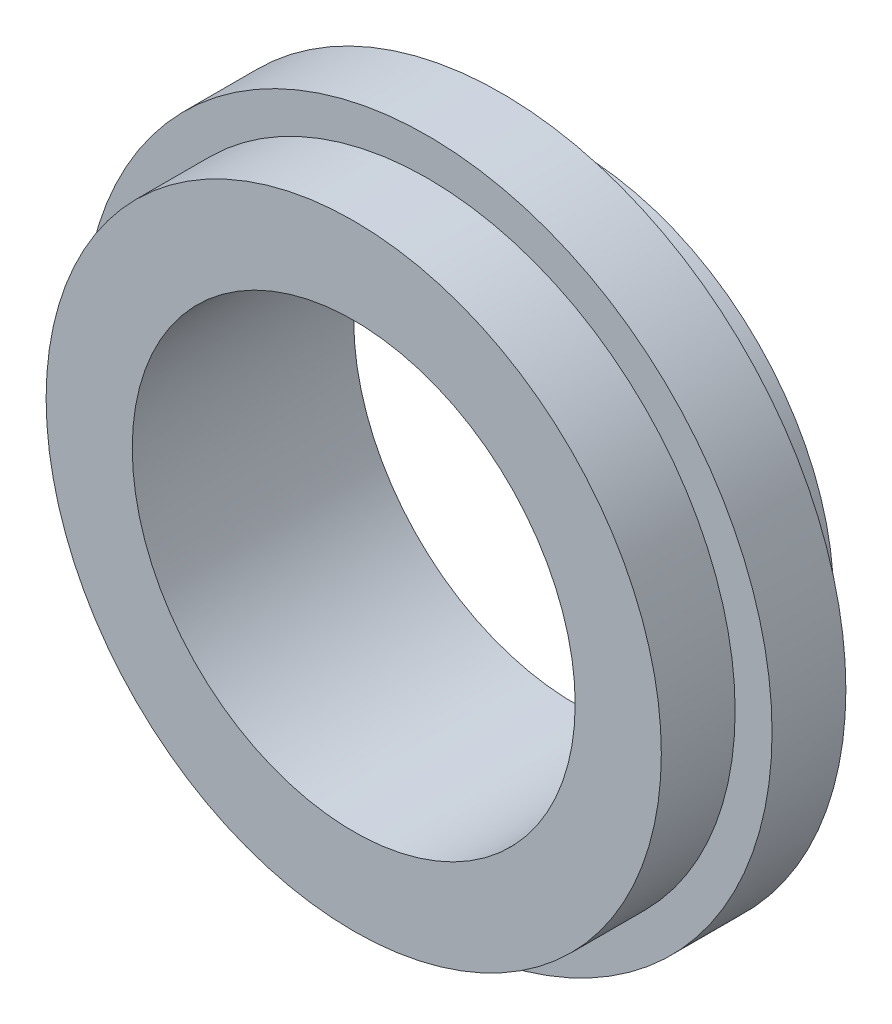
ISO-10303-21;
HEADER;
FILE_DESCRIPTION(('STEP AP214'),'2;1');
FILE_NAME('part.step','',(''),(''),'','','');
FILE_SCHEMA(('AUTOMOTIVE_DESIGN { 1 0 10303 214 1 1 1 1 }'));
ENDSEC;
DATA;
#1=APPLICATION_CONTEXT('core data for automotive mechanical design processes');
#2=APPLICATION_PROTOCOL_DEFINITION('international standard','automotive_design',2000,#1);
#3=PRODUCT_CONTEXT('',#1,'mechanical');
#4=PRODUCT('Part','Part','',(#3));
#5=PRODUCT_RELATED_PRODUCT_CATEGORY('part','',(#4));
#6=PRODUCT_DEFINITION_FORMATION('','',#4);
#7=PRODUCT_DEFINITION_CONTEXT('part definition',#1,'design');
#8=PRODUCT_DEFINITION('design','',#6,#7);
#9=PRODUCT_DEFINITION_SHAPE('','',#8);
#10=(LENGTH_UNIT() NAMED_UNIT(*) SI_UNIT(.MILLI.,.METRE.));
#11=(NAMED_UNIT(*) PLANE_ANGLE_UNIT() SI_UNIT($,.RADIAN.));
#12=(NAMED_UNIT(*) SI_UNIT($,.STERADIAN.) SOLID_ANGLE_UNIT());
#13=UNCERTAINTY_MEASURE_WITH_UNIT(LENGTH_MEASURE(1.E-05),#10,'distance_accuracy_value','');
#14=(GEOMETRIC_REPRESENTATION_CONTEXT(3) GLOBAL_UNCERTAINTY_ASSIGNED_CONTEXT((#13)) GLOBAL_UNIT_ASSIGNED_CONTEXT((#10,
#11,#12)) REPRESENTATION_CONTEXT('',''));
#15=CARTESIAN_POINT('',(0.,0.,0.));
#16=DIRECTION('',(0.,0.,1.));
#17=DIRECTION('',(1.,0.,0.));
#18=AXIS2_PLACEMENT_3D('',#15,#16,#17);
#19=CARTESIAN_POINT('',(0.,0.,0.));
#20=DIRECTION('',(0.,0.,1.));
#21=DIRECTION('',(1.,0.,0.));
#22=AXIS2_PLACEMENT_3D('',#19,#20,#21);
#23=PLANE('',#22);
#24=CARTESIAN_POINT('',(0.,0.,0.));
#25=DIRECTION('',(0.,0.,1.));
#26=DIRECTION('',(1.,0.,0.));
#27=AXIS2_PLACEMENT_3D('',#24,#25,#26);
#28=CIRCLE('',#27,10.5);
#29=CARTESIAN_POINT('',(10.5,0.,0.));
#30=VERTEX_POINT('',#29);
#31=EDGE_CURVE('E39',#30,#30,#28,.T.);
#32=ORIENTED_EDGE('',*,*,#31,.F.);
#33=EDGE_LOOP('',(#32));
#34=FACE_BOUND('',#33,.T.);
#35=CARTESIAN_POINT('',(0.,0.,0.));
#36=DIRECTION('',(0.,0.,1.));
#37=DIRECTION('',(1.,0.,0.));
#38=AXIS2_PLACEMENT_3D('',#35,#36,#37);
#39=CIRCLE('',#38,9.);
#40=CARTESIAN_POINT('',(9.,0.,0.));
#41=VERTEX_POINT('',#40);
#42=EDGE_CURVE('E55',#41,#41,#39,.T.);
#43=ORIENTED_EDGE('',*,*,#42,.T.);
#44=EDGE_LOOP('',(#43));
#45=FACE_BOUND('',#44,.T.);
#46=ADVANCED_FACE('F35',(#34,#45),#23,.F.);
#47=CARTESIAN_POINT('',(0.,0.,3.));
#48=DIRECTION('',(0.,0.,-1.));
#49=DIRECTION('',(-1.,0.,0.));
#50=AXIS2_PLACEMENT_3D('',#47,#48,#49);
#51=CYLINDRICAL_SURFACE('',#50,10.5);
#52=CARTESIAN_POINT('',(0.,0.,3.));
#53=DIRECTION('',(0.,0.,1.));
#54=DIRECTION('',(1.,0.,0.));
#55=AXIS2_PLACEMENT_3D('',#52,#53,#54);
#56=CIRCLE('',#55,10.5);
#57=CARTESIAN_POINT('',(10.5,0.,3.));
#58=VERTEX_POINT('',#57);
#59=EDGE_CURVE('E43',#58,#58,#56,.T.);
#60=ORIENTED_EDGE('',*,*,#59,.F.);
#61=EDGE_LOOP('',(#60));
#62=FACE_BOUND('',#61,.T.);
#63=ORIENTED_EDGE('',*,*,#31,.T.);
#64=EDGE_LOOP('',(#63));
#65=FACE_BOUND('',#64,.T.);
#66=ADVANCED_FACE('F37',(#62,#65),#51,.T.);
#67=CARTESIAN_POINT('',(0.,0.,3.));
#68=DIRECTION('',(0.,0.,-1.));
#69=DIRECTION('',(-1.,0.,0.));
#70=AXIS2_PLACEMENT_3D('',#67,#68,#69);
#71=CYLINDRICAL_SURFACE('',#70,9.);
#72=ORIENTED_EDGE('',*,*,#42,.F.);
#73=EDGE_LOOP('',(#72));
#74=FACE_BOUND('',#73,.T.);
#75=CARTESIAN_POINT('',(0.,0.,9.));
#76=DIRECTION('',(0.,0.,1.));
#77=DIRECTION('',(1.,0.,0.));
#78=AXIS2_PLACEMENT_3D('',#75,#76,#77);
#79=CIRCLE('',#78,9.00000000000001);
#80=CARTESIAN_POINT('',(9.00000000000001,0.,9.));
#81=VERTEX_POINT('',#80);
#82=EDGE_CURVE('E102',#81,#81,#79,.T.);
#83=ORIENTED_EDGE('',*,*,#82,.T.);
#84=EDGE_LOOP('',(#83));
#85=FACE_BOUND('',#84,.T.);
#86=ADVANCED_FACE('F70',(#74,#85),#71,.F.);
#87=CARTESIAN_POINT('',(0.,0.,6.));
#88=DIRECTION('',(0.,0.,1.));
#89=DIRECTION('',(1.,0.,0.));
#90=AXIS2_PLACEMENT_3D('',#87,#88,#89);
#91=PLANE('',#90);
#92=CARTESIAN_POINT('',(0.,0.,6.));
#93=DIRECTION('',(0.,0.,1.));
#94=DIRECTION('',(1.,0.,0.));
#95=AXIS2_PLACEMENT_3D('',#92,#93,#94);
#96=CIRCLE('',#95,12.5);
#97=CARTESIAN_POINT('',(12.5,0.,6.));
#98=VERTEX_POINT('',#97);
#99=EDGE_CURVE('E10',#98,#98,#96,.T.);
#100=ORIENTED_EDGE('',*,*,#99,.F.);
#101=EDGE_LOOP('',(#100));
#102=FACE_BOUND('',#101,.T.);
#103=CARTESIAN_POINT('',(0.,0.,6.));
#104=DIRECTION('',(0.,0.,1.));
#105=DIRECTION('',(1.,0.,0.));
#106=AXIS2_PLACEMENT_3D('',#103,#104,#105);
#107=CIRCLE('',#106,14.);
#108=CARTESIAN_POINT('',(14.,0.,6.));
#109=VERTEX_POINT('',#108);
#110=EDGE_CURVE('E52',#109,#109,#107,.T.);
#111=ORIENTED_EDGE('',*,*,#110,.T.);
#112=EDGE_LOOP('',(#111));
#113=FACE_BOUND('',#112,.T.);
#114=ADVANCED_FACE('F75',(#102,#113),#91,.T.);
#115=CARTESIAN_POINT('',(0.,0.,3.));
#116=DIRECTION('',(0.,0.,1.));
#117=DIRECTION('',(1.,0.,0.));
#118=AXIS2_PLACEMENT_3D('',#115,#116,#117);
#119=PLANE('',#118);
#120=ORIENTED_EDGE('',*,*,#59,.T.);
#121=EDGE_LOOP('',(#120));
#122=FACE_BOUND('',#121,.T.);
#123=CARTESIAN_POINT('',(0.,0.,3.));
#124=DIRECTION('',(0.,0.,1.));
#125=DIRECTION('',(1.,0.,0.));
#126=AXIS2_PLACEMENT_3D('',#123,#124,#125);
#127=CIRCLE('',#126,14.);
#128=CARTESIAN_POINT('',(14.,0.,3.));
#129=VERTEX_POINT('',#128);
#130=EDGE_CURVE('E56',#129,#129,#127,.T.);
#131=ORIENTED_EDGE('',*,*,#130,.F.);
#132=EDGE_LOOP('',(#131));
#133=FACE_BOUND('',#132,.T.);
#134=ADVANCED_FACE('F81',(#122,#133),#119,.F.);
#135=CARTESIAN_POINT('',(0.,0.,6.));
#136=DIRECTION('',(0.,0.,-1.));
#137=DIRECTION('',(-1.,0.,0.));
#138=AXIS2_PLACEMENT_3D('',#135,#136,#137);
#139=CYLINDRICAL_SURFACE('',#138,14.);
#140=ORIENTED_EDGE('',*,*,#110,.F.);
#141=EDGE_LOOP('',(#140));
#142=FACE_BOUND('',#141,.T.);
#143=ORIENTED_EDGE('',*,*,#130,.T.);
#144=EDGE_LOOP('',(#143));
#145=FACE_BOUND('',#144,.T.);
#146=ADVANCED_FACE('F77',(#142,#145),#139,.T.);
#147=CARTESIAN_POINT('',(0.,0.,9.));
#148=DIRECTION('',(0.,0.,1.));
#149=DIRECTION('',(1.,0.,0.));
#150=AXIS2_PLACEMENT_3D('',#147,#148,#149);
#151=PLANE('',#150);
#152=CARTESIAN_POINT('',(0.,0.,9.));
#153=DIRECTION('',(0.,0.,1.));
#154=DIRECTION('',(1.,0.,0.));
#155=AXIS2_PLACEMENT_3D('',#152,#153,#154);
#156=CIRCLE('',#155,12.5);
#157=CARTESIAN_POINT('',(12.5,0.,9.));
#158=VERTEX_POINT('',#157);
#159=EDGE_CURVE('E50',#158,#158,#156,.T.);
#160=ORIENTED_EDGE('',*,*,#159,.T.);
#161=EDGE_LOOP('',(#160));
#162=FACE_BOUND('',#161,.T.);
#163=ORIENTED_EDGE('',*,*,#82,.F.);
#164=EDGE_LOOP('',(#163));
#165=FACE_BOUND('',#164,.T.);
#166=ADVANCED_FACE('F80',(#162,#165),#151,.T.);
#167=CARTESIAN_POINT('',(0.,0.,9.));
#168=DIRECTION('',(0.,0.,-1.));
#169=DIRECTION('',(-1.,0.,0.));
#170=AXIS2_PLACEMENT_3D('',#167,#168,#169);
#171=CYLINDRICAL_SURFACE('',#170,12.5);
#172=ORIENTED_EDGE('',*,*,#159,.F.);
#173=EDGE_LOOP('',(#172));
#174=FACE_BOUND('',#173,.T.);
#175=ORIENTED_EDGE('',*,*,#99,.T.);
#176=EDGE_LOOP('',(#175));
#177=FACE_BOUND('',#176,.T.);
#178=ADVANCED_FACE('F89',(#174,#177),#171,.T.);
#179=CLOSED_SHELL('',(#46,#66,#86,#114,#134,#146,#166,#178));
#180=MANIFOLD_SOLID_BREP('B2',#179);
#181=ADVANCED_BREP_SHAPE_REPRESENTATION('',(#18,#180),#14);
#182=SHAPE_DEFINITION_REPRESENTATION(#9,#181);
ENDSEC;
END-ISO-10303-21;
